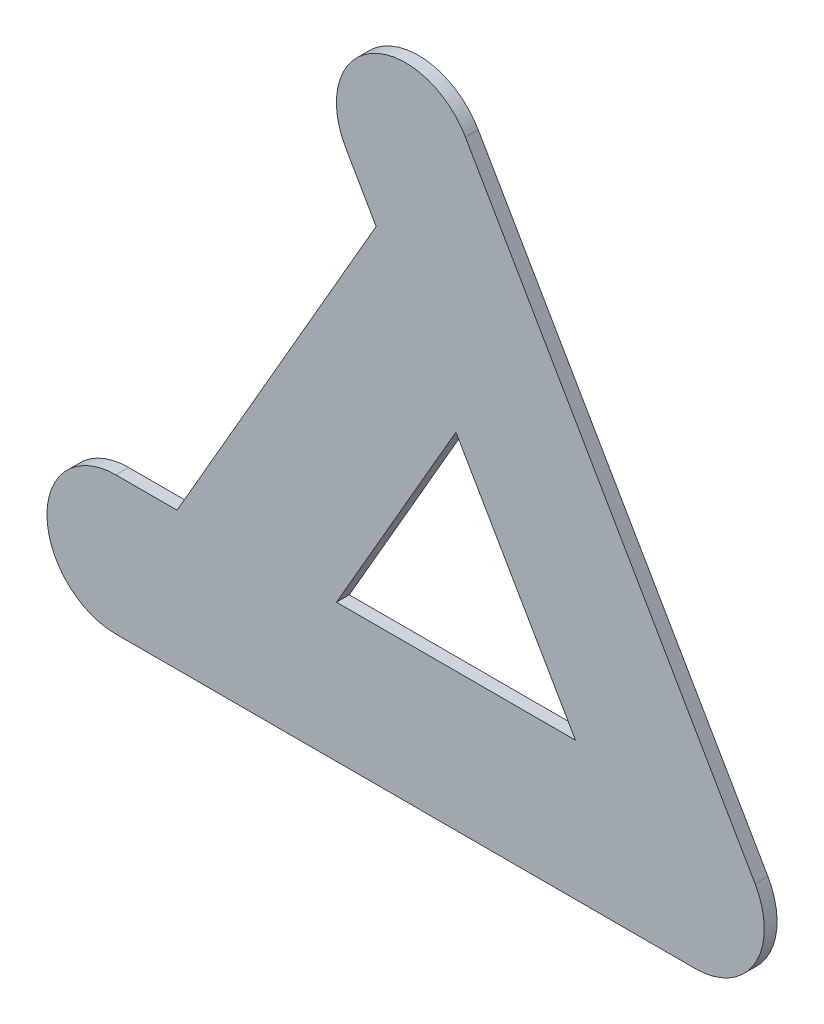
ISO-10303-21;
HEADER;
FILE_DESCRIPTION(('STEP AP214'),'2;1');
FILE_NAME('part.step','',(''),(''),'','','');
FILE_SCHEMA(('AUTOMOTIVE_DESIGN { 1 0 10303 214 1 1 1 1 }'));
ENDSEC;
DATA;
#1=APPLICATION_CONTEXT('core data for automotive mechanical design processes');
#2=APPLICATION_PROTOCOL_DEFINITION('international standard','automotive_design',2000,#1);
#3=PRODUCT_CONTEXT('',#1,'mechanical');
#4=PRODUCT('Part','Part','',(#3));
#5=PRODUCT_RELATED_PRODUCT_CATEGORY('part','',(#4));
#6=PRODUCT_DEFINITION_FORMATION('','',#4);
#7=PRODUCT_DEFINITION_CONTEXT('part definition',#1,'design');
#8=PRODUCT_DEFINITION('design','',#6,#7);
#9=PRODUCT_DEFINITION_SHAPE('','',#8);
#10=(LENGTH_UNIT() NAMED_UNIT(*) SI_UNIT(.MILLI.,.METRE.));
#11=(NAMED_UNIT(*) PLANE_ANGLE_UNIT() SI_UNIT($,.RADIAN.));
#12=(NAMED_UNIT(*) SI_UNIT($,.STERADIAN.) SOLID_ANGLE_UNIT());
#13=UNCERTAINTY_MEASURE_WITH_UNIT(LENGTH_MEASURE(1.E-05),#10,'distance_accuracy_value','');
#14=(GEOMETRIC_REPRESENTATION_CONTEXT(3) GLOBAL_UNCERTAINTY_ASSIGNED_CONTEXT((#13)) GLOBAL_UNIT_ASSIGNED_CONTEXT((#10,
#11,#12)) REPRESENTATION_CONTEXT('',''));
#15=CARTESIAN_POINT('',(0.,0.,0.));
#16=DIRECTION('',(0.,0.,1.));
#17=DIRECTION('',(1.,0.,0.));
#18=AXIS2_PLACEMENT_3D('',#15,#16,#17);
#19=CARTESIAN_POINT('',(0.,0.,0.05));
#20=DIRECTION('',(0.,0.,1.));
#21=DIRECTION('',(1.,0.,0.));
#22=AXIS2_PLACEMENT_3D('',#19,#20,#21);
#23=PLANE('',#22);
#24=DIRECTION('',(1.,0.,0.));
#25=VECTOR('',#24,1.);
#26=CARTESIAN_POINT('',(2.336,-1.349,0.05));
#27=LINE('',#26,#25);
#28=CARTESIAN_POINT('',(1.402,-1.349,0.05));
#29=VERTEX_POINT('',#28);
#30=CARTESIAN_POINT('',(2.33600000000001,-1.349,0.05));
#31=VERTEX_POINT('',#30);
#32=EDGE_CURVE('E177',#29,#31,#27,.T.);
#33=ORIENTED_EDGE('',*,*,#32,.F.);
#34=DIRECTION('',(0.499938683107804,0.866060802214507,0.));
#35=VECTOR('',#34,1.);
#36=CARTESIAN_POINT('',(1.402,-1.349,0.05));
#37=LINE('',#36,#35);
#38=CARTESIAN_POINT('',(1.86900000000001,-0.540000000000005,0.05));
#39=VERTEX_POINT('',#38);
#40=EDGE_CURVE('E186',#39,#29,#37,.F.);
#41=ORIENTED_EDGE('',*,*,#40,.F.);
#42=DIRECTION('',(0.499938683107804,-0.866060802214507,0.));
#43=VECTOR('',#42,1.);
#44=CARTESIAN_POINT('',(1.869,-0.54,0.05));
#45=LINE('',#44,#43);
#46=EDGE_CURVE('E184',#31,#39,#45,.F.);
#47=ORIENTED_EDGE('',*,*,#46,.F.);
#48=EDGE_LOOP('',(#33,#41,#47));
#49=FACE_BOUND('',#48,.T.);
#50=DIRECTION('',(-0.499592735002601,-0.866260410692201,0.));
#51=VECTOR('',#50,1.);
#52=CARTESIAN_POINT('',(1.557,0.,0.05));
#53=LINE('',#52,#51);
#54=CARTESIAN_POINT('',(0.779000000000014,-1.34900000000001,0.05));
#55=VERTEX_POINT('',#54);
#56=CARTESIAN_POINT('',(1.557,0.,0.05));
#57=VERTEX_POINT('',#56);
#58=EDGE_CURVE('E112',#55,#57,#53,.F.);
#59=ORIENTED_EDGE('',*,*,#58,.F.);
#60=DIRECTION('',(1.,0.,0.));
#61=VECTOR('',#60,1.);
#62=CARTESIAN_POINT('',(0.779,-1.349,0.05));
#63=LINE('',#62,#61);
#64=CARTESIAN_POINT('',(0.54,-1.349,0.05));
#65=VERTEX_POINT('',#64);
#66=EDGE_CURVE('E109',#65,#55,#63,.T.);
#67=ORIENTED_EDGE('',*,*,#66,.F.);
#68=CARTESIAN_POINT('',(0.54,-1.6185,0.05));
#69=DIRECTION('',(0.,0.,1.));
#70=DIRECTION('',(1.,0.,0.));
#71=AXIS2_PLACEMENT_3D('',#68,#69,#70);
#72=CIRCLE('',#71,0.2695);
#73=CARTESIAN_POINT('',(0.54,-1.888,0.05));
#74=VERTEX_POINT('',#73);
#75=EDGE_CURVE('E20',#74,#65,#72,.F.);
#76=ORIENTED_EDGE('',*,*,#75,.F.);
#77=DIRECTION('',(1.,0.,0.));
#78=VECTOR('',#77,1.);
#79=CARTESIAN_POINT('',(0.54,-1.888,0.05));
#80=LINE('',#79,#78);
#81=CARTESIAN_POINT('',(2.804,-1.8879999999997,0.05));
#82=VERTEX_POINT('',#81);
#83=EDGE_CURVE('E96',#82,#74,#80,.F.);
#84=ORIENTED_EDGE('',*,*,#83,.F.);
#85=CARTESIAN_POINT('',(2.804375136871,-1.618449955514,0.05));
#86=DIRECTION('',(0.,0.,1.));
#87=DIRECTION('',(1.,0.,0.));
#88=AXIS2_PLACEMENT_3D('',#85,#86,#87);
#89=CIRCLE('',#88,0.2695503055273);
#90=CARTESIAN_POINT('',(3.038,-1.484,0.05));
#91=VERTEX_POINT('',#90);
#92=EDGE_CURVE('E157',#91,#82,#89,.F.);
#93=ORIENTED_EDGE('',*,*,#92,.F.);
#94=DIRECTION('',(-0.499939092574703,0.866060565847206,0.));
#95=VECTOR('',#94,1.);
#96=CARTESIAN_POINT('',(3.038,-1.484,0.05));
#97=LINE('',#96,#95);
#98=CARTESIAN_POINT('',(1.90600000000003,0.477000000000018,0.05));
#99=VERTEX_POINT('',#98);
#100=EDGE_CURVE('E141',#99,#91,#97,.F.);
#101=ORIENTED_EDGE('',*,*,#100,.F.);
#102=CARTESIAN_POINT('',(1.672,0.342,0.05));
#103=DIRECTION('',(0.,0.,1.));
#104=DIRECTION('',(1.,0.,0.));
#105=AXIS2_PLACEMENT_3D('',#102,#103,#104);
#106=CIRCLE('',#105,0.2701499583565);
#107=CARTESIAN_POINT('',(1.438,0.207,0.05));
#108=VERTEX_POINT('',#107);
#109=EDGE_CURVE('E156',#108,#99,#106,.F.);
#110=ORIENTED_EDGE('',*,*,#109,.F.);
#111=DIRECTION('',(0.498392434149899,-0.866951545117799,0.));
#112=VECTOR('',#111,1.);
#113=CARTESIAN_POINT('',(1.438,0.207,0.05));
#114=LINE('',#113,#112);
#115=EDGE_CURVE('E130',#57,#108,#114,.F.);
#116=ORIENTED_EDGE('',*,*,#115,.F.);
#117=EDGE_LOOP('',(#59,#67,#76,#84,#93,#101,#110,#116));
#118=FACE_BOUND('',#117,.T.);
#119=ADVANCED_FACE('F17',(#49,#118),#23,.T.);
#120=CARTESIAN_POINT('',(0.779,-1.349,0.));
#121=DIRECTION('',(0.,1.,0.));
#122=DIRECTION('',(0.,0.,1.));
#123=AXIS2_PLACEMENT_3D('',#120,#121,#122);
#124=PLANE('',#123);
#125=DIRECTION('',(0.,0.,1.));
#126=VECTOR('',#125,1.);
#127=CARTESIAN_POINT('',(0.779000000000021,-1.34900000000001,0.));
#128=LINE('',#127,#126);
#129=CARTESIAN_POINT('',(0.779000000000007,-1.349,0.));
#130=VERTEX_POINT('',#129);
#131=EDGE_CURVE('E125',#130,#55,#128,.T.);
#132=ORIENTED_EDGE('',*,*,#131,.F.);
#133=DIRECTION('',(1.,0.,0.));
#134=VECTOR('',#133,1.);
#135=CARTESIAN_POINT('',(0.,-1.349,0.));
#136=LINE('',#135,#134);
#137=CARTESIAN_POINT('',(0.54,-1.349,0.));
#138=VERTEX_POINT('',#137);
#139=EDGE_CURVE('E119',#130,#138,#136,.F.);
#140=ORIENTED_EDGE('',*,*,#139,.T.);
#141=DIRECTION('',(0.,0.,1.));
#142=VECTOR('',#141,1.);
#143=CARTESIAN_POINT('',(0.54,-1.349,0.));
#144=LINE('',#143,#142);
#145=EDGE_CURVE('E105',#65,#138,#144,.F.);
#146=ORIENTED_EDGE('',*,*,#145,.F.);
#147=ORIENTED_EDGE('',*,*,#66,.T.);
#148=EDGE_LOOP('',(#132,#140,#146,#147));
#149=FACE_BOUND('',#148,.T.);
#150=ADVANCED_FACE('F118',(#149),#124,.T.);
#151=CARTESIAN_POINT('',(0.54,-1.6185,0.));
#152=DIRECTION('',(0.,0.,1.));
#153=DIRECTION('',(1.,0.,0.));
#154=AXIS2_PLACEMENT_3D('',#151,#152,#153);
#155=CYLINDRICAL_SURFACE('',#154,0.2695);
#156=ORIENTED_EDGE('',*,*,#145,.T.);
#157=CARTESIAN_POINT('',(0.54,-1.6185,0.));
#158=DIRECTION('',(0.,0.,1.));
#159=DIRECTION('',(1.,0.,0.));
#160=AXIS2_PLACEMENT_3D('',#157,#158,#159);
#161=CIRCLE('',#160,0.2695);
#162=CARTESIAN_POINT('',(0.54,-1.888,0.));
#163=VERTEX_POINT('',#162);
#164=EDGE_CURVE('E154',#138,#163,#161,.T.);
#165=ORIENTED_EDGE('',*,*,#164,.T.);
#166=DIRECTION('',(0.,0.,-1.));
#167=VECTOR('',#166,1.);
#168=CARTESIAN_POINT('',(0.54,-1.888,0.));
#169=LINE('',#168,#167);
#170=EDGE_CURVE('E107',#74,#163,#169,.T.);
#171=ORIENTED_EDGE('',*,*,#170,.F.);
#172=ORIENTED_EDGE('',*,*,#75,.T.);
#173=EDGE_LOOP('',(#156,#165,#171,#172));
#174=FACE_BOUND('',#173,.T.);
#175=ADVANCED_FACE('F102',(#174),#155,.T.);
#176=CARTESIAN_POINT('',(0.54,-1.888,0.));
#177=DIRECTION('',(0.,-1.,0.));
#178=DIRECTION('',(0.,0.,-1.));
#179=AXIS2_PLACEMENT_3D('',#176,#177,#178);
#180=PLANE('',#179);
#181=ORIENTED_EDGE('',*,*,#170,.T.);
#182=DIRECTION('',(1.,0.,0.));
#183=VECTOR('',#182,1.);
#184=CARTESIAN_POINT('',(0.,-1.888,0.));
#185=LINE('',#184,#183);
#186=CARTESIAN_POINT('',(2.804,-1.8879999999997,0.));
#187=VERTEX_POINT('',#186);
#188=EDGE_CURVE('E153',#163,#187,#185,.T.);
#189=ORIENTED_EDGE('',*,*,#188,.T.);
#190=DIRECTION('',(0.,0.,1.));
#191=VECTOR('',#190,1.);
#192=CARTESIAN_POINT('',(2.804,-1.8879999999996,0.));
#193=LINE('',#192,#191);
#194=EDGE_CURVE('E143',#82,#187,#193,.F.);
#195=ORIENTED_EDGE('',*,*,#194,.F.);
#196=ORIENTED_EDGE('',*,*,#83,.T.);
#197=EDGE_LOOP('',(#181,#189,#195,#196));
#198=FACE_BOUND('',#197,.T.);
#199=ADVANCED_FACE('F163',(#198),#180,.T.);
#200=CARTESIAN_POINT('',(2.804375136871,-1.618449955514,0.));
#201=DIRECTION('',(0.,0.,1.));
#202=DIRECTION('',(1.,0.,0.));
#203=AXIS2_PLACEMENT_3D('',#200,#201,#202);
#204=CYLINDRICAL_SURFACE('',#203,0.2695503055273);
#205=ORIENTED_EDGE('',*,*,#194,.T.);
#206=CARTESIAN_POINT('',(2.804375136871,-1.618449955514,0.));
#207=DIRECTION('',(0.,0.,1.));
#208=DIRECTION('',(1.,0.,0.));
#209=AXIS2_PLACEMENT_3D('',#206,#207,#208);
#210=CIRCLE('',#209,0.2695503055273);
#211=CARTESIAN_POINT('',(3.038,-1.484,0.));
#212=VERTEX_POINT('',#211);
#213=EDGE_CURVE('E150',#187,#212,#210,.T.);
#214=ORIENTED_EDGE('',*,*,#213,.T.);
#215=DIRECTION('',(0.,0.,1.));
#216=VECTOR('',#215,1.);
#217=CARTESIAN_POINT('',(3.038,-1.484,0.));
#218=LINE('',#217,#216);
#219=EDGE_CURVE('E142',#91,#212,#218,.F.);
#220=ORIENTED_EDGE('',*,*,#219,.F.);
#221=ORIENTED_EDGE('',*,*,#92,.T.);
#222=EDGE_LOOP('',(#205,#214,#220,#221));
#223=FACE_BOUND('',#222,.T.);
#224=ADVANCED_FACE('F205',(#223),#204,.T.);
#225=CARTESIAN_POINT('',(3.038,-1.484,0.));
#226=DIRECTION('',(0.866060565847206,0.499939092574703,0.));
#227=DIRECTION('',(-0.499939092574703,0.866060565847206,0.));
#228=AXIS2_PLACEMENT_3D('',#225,#226,#227);
#229=PLANE('',#228);
#230=ORIENTED_EDGE('',*,*,#219,.T.);
#231=DIRECTION('',(-0.49993909257472,0.866060565847196,0.));
#232=VECTOR('',#231,1.);
#233=CARTESIAN_POINT('',(3.038,-1.484,0.));
#234=LINE('',#233,#232);
#235=CARTESIAN_POINT('',(1.90600000000002,0.477000000000013,0.));
#236=VERTEX_POINT('',#235);
#237=EDGE_CURVE('E149',#212,#236,#234,.T.);
#238=ORIENTED_EDGE('',*,*,#237,.T.);
#239=DIRECTION('',(0.,0.,1.));
#240=VECTOR('',#239,1.);
#241=CARTESIAN_POINT('',(1.90600000000003,0.477000000000017,0.));
#242=LINE('',#241,#240);
#243=EDGE_CURVE('E132',#99,#236,#242,.F.);
#244=ORIENTED_EDGE('',*,*,#243,.F.);
#245=ORIENTED_EDGE('',*,*,#100,.T.);
#246=EDGE_LOOP('',(#230,#238,#244,#245));
#247=FACE_BOUND('',#246,.T.);
#248=ADVANCED_FACE('F201',(#247),#229,.T.);
#249=CARTESIAN_POINT('',(1.672,0.342,0.));
#250=DIRECTION('',(0.,0.,1.));
#251=DIRECTION('',(1.,0.,0.));
#252=AXIS2_PLACEMENT_3D('',#249,#250,#251);
#253=CYLINDRICAL_SURFACE('',#252,0.2701499583565);
#254=ORIENTED_EDGE('',*,*,#243,.T.);
#255=CARTESIAN_POINT('',(1.672,0.342,0.));
#256=DIRECTION('',(0.,0.,1.));
#257=DIRECTION('',(1.,0.,0.));
#258=AXIS2_PLACEMENT_3D('',#255,#256,#257);
#259=CIRCLE('',#258,0.2701499583565);
#260=CARTESIAN_POINT('',(1.438,0.207,0.));
#261=VERTEX_POINT('',#260);
#262=EDGE_CURVE('E145',#236,#261,#259,.T.);
#263=ORIENTED_EDGE('',*,*,#262,.T.);
#264=DIRECTION('',(0.,0.,1.));
#265=VECTOR('',#264,1.);
#266=CARTESIAN_POINT('',(1.438,0.207,0.));
#267=LINE('',#266,#265);
#268=EDGE_CURVE('E127',#108,#261,#267,.F.);
#269=ORIENTED_EDGE('',*,*,#268,.F.);
#270=ORIENTED_EDGE('',*,*,#109,.T.);
#271=EDGE_LOOP('',(#254,#263,#269,#270));
#272=FACE_BOUND('',#271,.T.);
#273=ADVANCED_FACE('F213',(#272),#253,.T.);
#274=CARTESIAN_POINT('',(1.438,0.207,0.));
#275=DIRECTION('',(-0.866951545117799,-0.498392434149899,0.));
#276=DIRECTION('',(0.498392434149899,-0.866951545117799,0.));
#277=AXIS2_PLACEMENT_3D('',#274,#275,#276);
#278=PLANE('',#277);
#279=ORIENTED_EDGE('',*,*,#268,.T.);
#280=DIRECTION('',(0.498392434149859,-0.866951545117822,0.));
#281=VECTOR('',#280,1.);
#282=CARTESIAN_POINT('',(1.438,0.207,0.));
#283=LINE('',#282,#281);
#284=CARTESIAN_POINT('',(1.557,0.,0.));
#285=VERTEX_POINT('',#284);
#286=EDGE_CURVE('E148',#261,#285,#283,.T.);
#287=ORIENTED_EDGE('',*,*,#286,.T.);
#288=DIRECTION('',(0.,0.,1.));
#289=VECTOR('',#288,1.);
#290=CARTESIAN_POINT('',(1.557,0.,0.));
#291=LINE('',#290,#289);
#292=EDGE_CURVE('E136',#57,#285,#291,.F.);
#293=ORIENTED_EDGE('',*,*,#292,.F.);
#294=ORIENTED_EDGE('',*,*,#115,.T.);
#295=EDGE_LOOP('',(#279,#287,#293,#294));
#296=FACE_BOUND('',#295,.T.);
#297=ADVANCED_FACE('F237',(#296),#278,.T.);
#298=CARTESIAN_POINT('',(1.557,0.,0.));
#299=DIRECTION('',(-0.866260410692201,0.499592735002601,0.));
#300=DIRECTION('',(-0.499592735002601,-0.866260410692201,0.));
#301=AXIS2_PLACEMENT_3D('',#298,#299,#300);
#302=PLANE('',#301);
#303=ORIENTED_EDGE('',*,*,#292,.T.);
#304=DIRECTION('',(-0.499592735002614,-0.866260410692194,0.));
#305=VECTOR('',#304,1.);
#306=CARTESIAN_POINT('',(1.557,0.,0.));
#307=LINE('',#306,#305);
#308=EDGE_CURVE('E189',#285,#130,#307,.T.);
#309=ORIENTED_EDGE('',*,*,#308,.T.);
#310=ORIENTED_EDGE('',*,*,#131,.T.);
#311=ORIENTED_EDGE('',*,*,#58,.T.);
#312=EDGE_LOOP('',(#303,#309,#310,#311));
#313=FACE_BOUND('',#312,.T.);
#314=ADVANCED_FACE('F233',(#313),#302,.T.);
#315=CARTESIAN_POINT('',(1.402,-1.349,0.));
#316=DIRECTION('',(0.866060802214507,-0.499938683107804,0.));
#317=DIRECTION('',(0.499938683107804,0.866060802214507,0.));
#318=AXIS2_PLACEMENT_3D('',#315,#316,#317);
#319=PLANE('',#318);
#320=DIRECTION('',(0.,0.,1.));
#321=VECTOR('',#320,1.);
#322=CARTESIAN_POINT('',(1.402,-1.349,0.));
#323=LINE('',#322,#321);
#324=CARTESIAN_POINT('',(1.402,-1.349,0.));
#325=VERTEX_POINT('',#324);
#326=EDGE_CURVE('E179',#325,#29,#323,.T.);
#327=ORIENTED_EDGE('',*,*,#326,.F.);
#328=DIRECTION('',(0.499938683107768,0.866060802214527,0.));
#329=VECTOR('',#328,1.);
#330=CARTESIAN_POINT('',(1.402,-1.349,0.));
#331=LINE('',#330,#329);
#332=CARTESIAN_POINT('',(1.86900000000002,-0.54000000000001,0.));
#333=VERTEX_POINT('',#332);
#334=EDGE_CURVE('E192',#325,#333,#331,.T.);
#335=ORIENTED_EDGE('',*,*,#334,.T.);
#336=DIRECTION('',(0.,0.,1.));
#337=VECTOR('',#336,1.);
#338=CARTESIAN_POINT('',(1.869,-0.54,0.));
#339=LINE('',#338,#337);
#340=EDGE_CURVE('E182',#39,#333,#339,.F.);
#341=ORIENTED_EDGE('',*,*,#340,.F.);
#342=ORIENTED_EDGE('',*,*,#40,.T.);
#343=EDGE_LOOP('',(#327,#335,#341,#342));
#344=FACE_BOUND('',#343,.T.);
#345=ADVANCED_FACE('F229',(#344),#319,.T.);
#346=CARTESIAN_POINT('',(1.869,-0.54,0.));
#347=DIRECTION('',(-0.866060802214507,-0.499938683107804,0.));
#348=DIRECTION('',(0.499938683107804,-0.866060802214507,0.));
#349=AXIS2_PLACEMENT_3D('',#346,#347,#348);
#350=PLANE('',#349);
#351=ORIENTED_EDGE('',*,*,#340,.T.);
#352=DIRECTION('',(0.499938683107768,-0.866060802214527,0.));
#353=VECTOR('',#352,1.);
#354=CARTESIAN_POINT('',(1.869,-0.54,0.));
#355=LINE('',#354,#353);
#356=CARTESIAN_POINT('',(2.33600000000002,-1.34899999999999,0.));
#357=VERTEX_POINT('',#356);
#358=EDGE_CURVE('E26',#333,#357,#355,.T.);
#359=ORIENTED_EDGE('',*,*,#358,.T.);
#360=DIRECTION('',(0.,0.,1.));
#361=VECTOR('',#360,1.);
#362=CARTESIAN_POINT('',(2.336,-1.349,0.));
#363=LINE('',#362,#361);
#364=EDGE_CURVE('E34',#31,#357,#363,.F.);
#365=ORIENTED_EDGE('',*,*,#364,.F.);
#366=ORIENTED_EDGE('',*,*,#46,.T.);
#367=EDGE_LOOP('',(#351,#359,#365,#366));
#368=FACE_BOUND('',#367,.T.);
#369=ADVANCED_FACE('F223',(#368),#350,.T.);
#370=CARTESIAN_POINT('',(2.336,-1.349,0.));
#371=DIRECTION('',(0.,1.,0.));
#372=DIRECTION('',(0.,0.,1.));
#373=AXIS2_PLACEMENT_3D('',#370,#371,#372);
#374=PLANE('',#373);
#375=ORIENTED_EDGE('',*,*,#364,.T.);
#376=DIRECTION('',(1.,0.,0.));
#377=VECTOR('',#376,1.);
#378=CARTESIAN_POINT('',(0.,-1.349,0.));
#379=LINE('',#378,#377);
#380=EDGE_CURVE('E11',#357,#325,#379,.F.);
#381=ORIENTED_EDGE('',*,*,#380,.T.);
#382=ORIENTED_EDGE('',*,*,#326,.T.);
#383=ORIENTED_EDGE('',*,*,#32,.T.);
#384=EDGE_LOOP('',(#375,#381,#382,#383));
#385=FACE_BOUND('',#384,.T.);
#386=ADVANCED_FACE('F217',(#385),#374,.T.);
#387=CARTESIAN_POINT('',(0.,0.,0.));
#388=DIRECTION('',(0.,0.,1.));
#389=DIRECTION('',(1.,0.,0.));
#390=AXIS2_PLACEMENT_3D('',#387,#388,#389);
#391=PLANE('',#390);
#392=ORIENTED_EDGE('',*,*,#358,.F.);
#393=ORIENTED_EDGE('',*,*,#334,.F.);
#394=ORIENTED_EDGE('',*,*,#380,.F.);
#395=EDGE_LOOP('',(#392,#393,#394));
#396=FACE_BOUND('',#395,.T.);
#397=ORIENTED_EDGE('',*,*,#286,.F.);
#398=ORIENTED_EDGE('',*,*,#262,.F.);
#399=ORIENTED_EDGE('',*,*,#237,.F.);
#400=ORIENTED_EDGE('',*,*,#213,.F.);
#401=ORIENTED_EDGE('',*,*,#188,.F.);
#402=ORIENTED_EDGE('',*,*,#164,.F.);
#403=ORIENTED_EDGE('',*,*,#139,.F.);
#404=ORIENTED_EDGE('',*,*,#308,.F.);
#405=EDGE_LOOP('',(#397,#398,#399,#400,#401,#402,#403,#404));
#406=FACE_BOUND('',#405,.T.);
#407=ADVANCED_FACE('F167',(#396,#406),#391,.F.);
#408=CLOSED_SHELL('',(#119,#150,#175,#199,#224,#248,#273,#297,#314,#345,#369,#386,#407));
#409=MANIFOLD_SOLID_BREP('B1',#408);
#410=ADVANCED_BREP_SHAPE_REPRESENTATION('',(#18,#409),#14);
#411=SHAPE_DEFINITION_REPRESENTATION(#9,#410);
ENDSEC;
END-ISO-10303-21;
